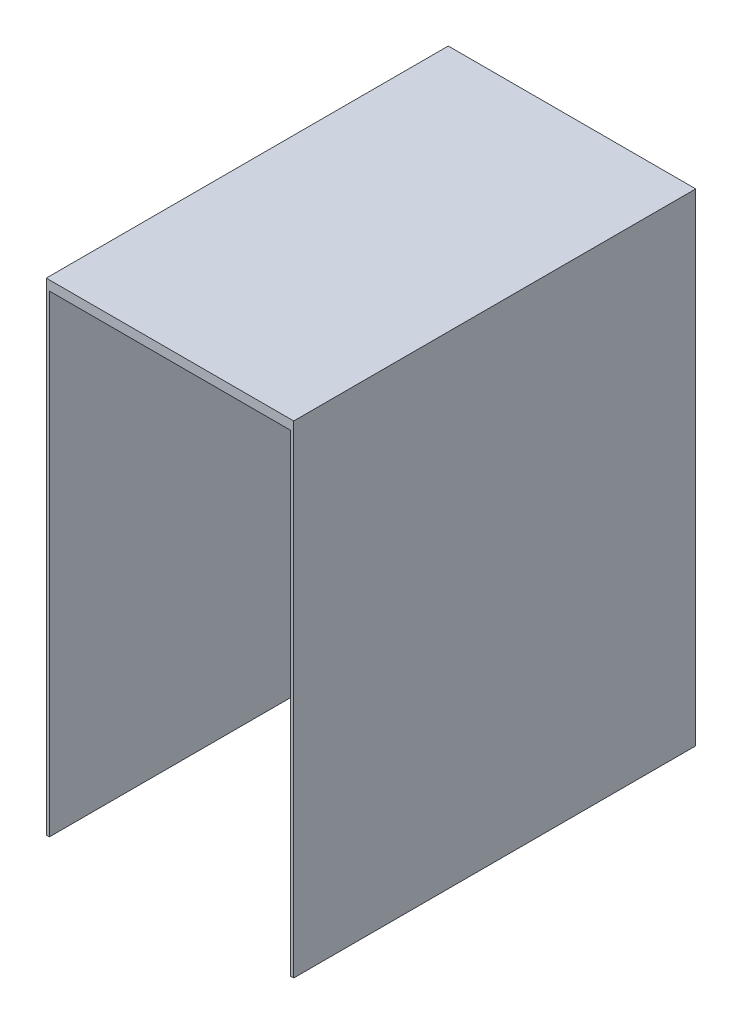
ISO-10303-21;
HEADER;
FILE_DESCRIPTION(('STEP AP214'),'2;1');
FILE_NAME('part.step','',(''),(''),'','','');
FILE_SCHEMA(('AUTOMOTIVE_DESIGN { 1 0 10303 214 1 1 1 1 }'));
ENDSEC;
DATA;
#1=APPLICATION_CONTEXT('core data for automotive mechanical design processes');
#2=APPLICATION_PROTOCOL_DEFINITION('international standard','automotive_design',2000,#1);
#3=PRODUCT_CONTEXT('',#1,'mechanical');
#4=PRODUCT('Part','Part','',(#3));
#5=PRODUCT_RELATED_PRODUCT_CATEGORY('part','',(#4));
#6=PRODUCT_DEFINITION_FORMATION('','',#4);
#7=PRODUCT_DEFINITION_CONTEXT('part definition',#1,'design');
#8=PRODUCT_DEFINITION('design','',#6,#7);
#9=PRODUCT_DEFINITION_SHAPE('','',#8);
#10=(LENGTH_UNIT() NAMED_UNIT(*) SI_UNIT(.MILLI.,.METRE.));
#11=(NAMED_UNIT(*) PLANE_ANGLE_UNIT() SI_UNIT($,.RADIAN.));
#12=(NAMED_UNIT(*) SI_UNIT($,.STERADIAN.) SOLID_ANGLE_UNIT());
#13=UNCERTAINTY_MEASURE_WITH_UNIT(LENGTH_MEASURE(1.E-05),#10,'distance_accuracy_value','');
#14=(GEOMETRIC_REPRESENTATION_CONTEXT(3) GLOBAL_UNCERTAINTY_ASSIGNED_CONTEXT((#13)) GLOBAL_UNIT_ASSIGNED_CONTEXT((#10,
#11,#12)) REPRESENTATION_CONTEXT('',''));
#15=CARTESIAN_POINT('',(0.,0.,0.));
#16=DIRECTION('',(0.,0.,1.));
#17=DIRECTION('',(1.,0.,0.));
#18=AXIS2_PLACEMENT_3D('',#15,#16,#17);
#19=CARTESIAN_POINT('',(0.990599999999999,0.,127.));
#20=DIRECTION('',(0.,1.,0.));
#21=DIRECTION('',(-1.,0.,0.));
#22=AXIS2_PLACEMENT_3D('',#19,#20,#21);
#23=PLANE('',#22);
#24=DIRECTION('',(1.,0.,0.));
#25=VECTOR('',#24,1.);
#26=CARTESIAN_POINT('',(0.990599999999999,0.,0.));
#27=LINE('',#26,#25);
#28=CARTESIAN_POINT('',(0.,0.,0.));
#29=VERTEX_POINT('',#28);
#30=CARTESIAN_POINT('',(0.990599999999999,0.,0.));
#31=VERTEX_POINT('',#30);
#32=EDGE_CURVE('E129',#29,#31,#27,.T.);
#33=ORIENTED_EDGE('',*,*,#32,.T.);
#34=DIRECTION('',(0.,0.,-1.));
#35=VECTOR('',#34,1.);
#36=CARTESIAN_POINT('',(0.990599999999999,0.,127.));
#37=LINE('',#36,#35);
#38=CARTESIAN_POINT('',(0.990599999999999,0.,127.));
#39=VERTEX_POINT('',#38);
#40=EDGE_CURVE('E11',#39,#31,#37,.T.);
#41=ORIENTED_EDGE('',*,*,#40,.F.);
#42=DIRECTION('',(1.,0.,0.));
#43=VECTOR('',#42,1.);
#44=CARTESIAN_POINT('',(0.990599999999999,0.,127.));
#45=LINE('',#44,#43);
#46=CARTESIAN_POINT('',(0.,0.,127.));
#47=VERTEX_POINT('',#46);
#48=EDGE_CURVE('E143',#47,#39,#45,.T.);
#49=ORIENTED_EDGE('',*,*,#48,.F.);
#50=DIRECTION('',(0.,0.,-1.));
#51=VECTOR('',#50,1.);
#52=CARTESIAN_POINT('',(0.,0.,127.));
#53=LINE('',#52,#51);
#54=EDGE_CURVE('E125',#47,#29,#53,.T.);
#55=ORIENTED_EDGE('',*,*,#54,.T.);
#56=EDGE_LOOP('',(#33,#41,#49,#55));
#57=FACE_BOUND('',#56,.T.);
#58=ADVANCED_FACE('F33',(#57),#23,.F.);
#59=CARTESIAN_POINT('',(0.990599999999981,149.352,127.));
#60=DIRECTION('',(-1.,0.,0.));
#61=DIRECTION('',(0.,-1.,0.));
#62=AXIS2_PLACEMENT_3D('',#59,#60,#61);
#63=PLANE('',#62);
#64=DIRECTION('',(0.,1.,0.));
#65=VECTOR('',#64,1.);
#66=CARTESIAN_POINT('',(0.990599999999981,149.352,0.));
#67=LINE('',#66,#65);
#68=CARTESIAN_POINT('',(0.990599999999981,149.352,0.));
#69=VERTEX_POINT('',#68);
#70=EDGE_CURVE('E132',#31,#69,#67,.T.);
#71=ORIENTED_EDGE('',*,*,#70,.T.);
#72=DIRECTION('',(0.,0.,-1.));
#73=VECTOR('',#72,1.);
#74=CARTESIAN_POINT('',(0.990599999999981,149.352,127.));
#75=LINE('',#74,#73);
#76=CARTESIAN_POINT('',(0.990599999999981,149.352,127.));
#77=VERTEX_POINT('',#76);
#78=EDGE_CURVE('E41',#77,#69,#75,.T.);
#79=ORIENTED_EDGE('',*,*,#78,.F.);
#80=DIRECTION('',(0.,1.,0.));
#81=VECTOR('',#80,1.);
#82=CARTESIAN_POINT('',(0.990599999999981,149.352,127.));
#83=LINE('',#82,#81);
#84=EDGE_CURVE('E92',#39,#77,#83,.T.);
#85=ORIENTED_EDGE('',*,*,#84,.F.);
#86=ORIENTED_EDGE('',*,*,#40,.T.);
#87=EDGE_LOOP('',(#71,#79,#85,#86));
#88=FACE_BOUND('',#87,.T.);
#89=ADVANCED_FACE('F178',(#88),#63,.F.);
#90=CARTESIAN_POINT('',(77.1906,149.352,127.));
#91=DIRECTION('',(0.,1.,0.));
#92=DIRECTION('',(0.,0.,1.));
#93=AXIS2_PLACEMENT_3D('',#90,#91,#92);
#94=PLANE('',#93);
#95=DIRECTION('',(1.,0.,0.));
#96=VECTOR('',#95,1.);
#97=CARTESIAN_POINT('',(77.1906,149.352,0.));
#98=LINE('',#97,#96);
#99=CARTESIAN_POINT('',(77.1906,149.352,0.));
#100=VERTEX_POINT('',#99);
#101=EDGE_CURVE('E134',#69,#100,#98,.T.);
#102=ORIENTED_EDGE('',*,*,#101,.T.);
#103=DIRECTION('',(0.,0.,-1.));
#104=VECTOR('',#103,1.);
#105=CARTESIAN_POINT('',(77.1906,149.352,127.));
#106=LINE('',#105,#104);
#107=CARTESIAN_POINT('',(77.1906,149.352,127.));
#108=VERTEX_POINT('',#107);
#109=EDGE_CURVE('E150',#108,#100,#106,.T.);
#110=ORIENTED_EDGE('',*,*,#109,.F.);
#111=DIRECTION('',(1.,0.,0.));
#112=VECTOR('',#111,1.);
#113=CARTESIAN_POINT('',(77.1906,149.352,127.));
#114=LINE('',#113,#112);
#115=EDGE_CURVE('E158',#77,#108,#114,.T.);
#116=ORIENTED_EDGE('',*,*,#115,.F.);
#117=ORIENTED_EDGE('',*,*,#78,.T.);
#118=EDGE_LOOP('',(#102,#110,#116,#117));
#119=FACE_BOUND('',#118,.T.);
#120=ADVANCED_FACE('F156',(#119),#94,.F.);
#121=CARTESIAN_POINT('',(77.1906,0.,127.));
#122=DIRECTION('',(1.,0.,0.));
#123=DIRECTION('',(0.,0.,-1.));
#124=AXIS2_PLACEMENT_3D('',#121,#122,#123);
#125=PLANE('',#124);
#126=DIRECTION('',(0.,-1.,0.));
#127=VECTOR('',#126,1.);
#128=CARTESIAN_POINT('',(77.1906,0.,0.));
#129=LINE('',#128,#127);
#130=CARTESIAN_POINT('',(77.1906,0.,0.));
#131=VERTEX_POINT('',#130);
#132=EDGE_CURVE('E136',#100,#131,#129,.T.);
#133=ORIENTED_EDGE('',*,*,#132,.T.);
#134=DIRECTION('',(0.,0.,-1.));
#135=VECTOR('',#134,1.);
#136=CARTESIAN_POINT('',(77.1906,0.,127.));
#137=LINE('',#136,#135);
#138=CARTESIAN_POINT('',(77.1906,0.,127.));
#139=VERTEX_POINT('',#138);
#140=EDGE_CURVE('E147',#139,#131,#137,.T.);
#141=ORIENTED_EDGE('',*,*,#140,.F.);
#142=DIRECTION('',(0.,-1.,0.));
#143=VECTOR('',#142,1.);
#144=CARTESIAN_POINT('',(77.1906,0.,127.));
#145=LINE('',#144,#143);
#146=EDGE_CURVE('E170',#108,#139,#145,.T.);
#147=ORIENTED_EDGE('',*,*,#146,.F.);
#148=ORIENTED_EDGE('',*,*,#109,.T.);
#149=EDGE_LOOP('',(#133,#141,#147,#148));
#150=FACE_BOUND('',#149,.T.);
#151=ADVANCED_FACE('F166',(#150),#125,.F.);
#152=CARTESIAN_POINT('',(78.1812,0.,127.));
#153=DIRECTION('',(0.,1.,0.));
#154=DIRECTION('',(-1.,0.,0.));
#155=AXIS2_PLACEMENT_3D('',#152,#153,#154);
#156=PLANE('',#155);
#157=DIRECTION('',(1.,0.,0.));
#158=VECTOR('',#157,1.);
#159=CARTESIAN_POINT('',(78.1812,0.,0.));
#160=LINE('',#159,#158);
#161=CARTESIAN_POINT('',(78.1812,0.,0.));
#162=VERTEX_POINT('',#161);
#163=EDGE_CURVE('E138',#131,#162,#160,.T.);
#164=ORIENTED_EDGE('',*,*,#163,.T.);
#165=DIRECTION('',(0.,0.,-1.));
#166=VECTOR('',#165,1.);
#167=CARTESIAN_POINT('',(78.1812,0.,127.));
#168=LINE('',#167,#166);
#169=CARTESIAN_POINT('',(78.1812,0.,127.));
#170=VERTEX_POINT('',#169);
#171=EDGE_CURVE('E120',#170,#162,#168,.T.);
#172=ORIENTED_EDGE('',*,*,#171,.F.);
#173=DIRECTION('',(1.,0.,0.));
#174=VECTOR('',#173,1.);
#175=CARTESIAN_POINT('',(78.1812,0.,127.));
#176=LINE('',#175,#174);
#177=EDGE_CURVE('E111',#139,#170,#176,.T.);
#178=ORIENTED_EDGE('',*,*,#177,.F.);
#179=ORIENTED_EDGE('',*,*,#140,.T.);
#180=EDGE_LOOP('',(#164,#172,#178,#179));
#181=FACE_BOUND('',#180,.T.);
#182=ADVANCED_FACE('F169',(#181),#156,.F.);
#183=CARTESIAN_POINT('',(78.1812,152.4,127.));
#184=DIRECTION('',(-1.,0.,0.));
#185=DIRECTION('',(0.,-1.,0.));
#186=AXIS2_PLACEMENT_3D('',#183,#184,#185);
#187=PLANE('',#186);
#188=DIRECTION('',(0.,1.,0.));
#189=VECTOR('',#188,1.);
#190=CARTESIAN_POINT('',(78.1812,152.4,0.));
#191=LINE('',#190,#189);
#192=CARTESIAN_POINT('',(78.1812,152.4,0.));
#193=VERTEX_POINT('',#192);
#194=EDGE_CURVE('E119',#162,#193,#191,.T.);
#195=ORIENTED_EDGE('',*,*,#194,.T.);
#196=DIRECTION('',(0.,0.,-1.));
#197=VECTOR('',#196,1.);
#198=CARTESIAN_POINT('',(78.1812,152.4,127.));
#199=LINE('',#198,#197);
#200=CARTESIAN_POINT('',(78.1812,152.4,127.));
#201=VERTEX_POINT('',#200);
#202=EDGE_CURVE('E116',#201,#193,#199,.T.);
#203=ORIENTED_EDGE('',*,*,#202,.F.);
#204=DIRECTION('',(0.,1.,0.));
#205=VECTOR('',#204,1.);
#206=CARTESIAN_POINT('',(78.1812,152.4,127.));
#207=LINE('',#206,#205);
#208=EDGE_CURVE('E105',#170,#201,#207,.T.);
#209=ORIENTED_EDGE('',*,*,#208,.F.);
#210=ORIENTED_EDGE('',*,*,#171,.T.);
#211=EDGE_LOOP('',(#195,#203,#209,#210));
#212=FACE_BOUND('',#211,.T.);
#213=ADVANCED_FACE('F117',(#212),#187,.F.);
#214=CARTESIAN_POINT('',(0.,152.4,127.));
#215=DIRECTION('',(0.,-1.,0.));
#216=DIRECTION('',(0.,0.,-1.));
#217=AXIS2_PLACEMENT_3D('',#214,#215,#216);
#218=PLANE('',#217);
#219=DIRECTION('',(-1.,0.,0.));
#220=VECTOR('',#219,1.);
#221=CARTESIAN_POINT('',(0.,152.4,0.));
#222=LINE('',#221,#220);
#223=CARTESIAN_POINT('',(0.,152.4,0.));
#224=VERTEX_POINT('',#223);
#225=EDGE_CURVE('E78',#193,#224,#222,.T.);
#226=ORIENTED_EDGE('',*,*,#225,.T.);
#227=DIRECTION('',(0.,0.,-1.));
#228=VECTOR('',#227,1.);
#229=CARTESIAN_POINT('',(0.,152.4,127.));
#230=LINE('',#229,#228);
#231=CARTESIAN_POINT('',(0.,152.4,127.));
#232=VERTEX_POINT('',#231);
#233=EDGE_CURVE('E121',#232,#224,#230,.T.);
#234=ORIENTED_EDGE('',*,*,#233,.F.);
#235=DIRECTION('',(-1.,0.,0.));
#236=VECTOR('',#235,1.);
#237=CARTESIAN_POINT('',(0.,152.4,127.));
#238=LINE('',#237,#236);
#239=EDGE_CURVE('E109',#201,#232,#238,.T.);
#240=ORIENTED_EDGE('',*,*,#239,.F.);
#241=ORIENTED_EDGE('',*,*,#202,.T.);
#242=EDGE_LOOP('',(#226,#234,#240,#241));
#243=FACE_BOUND('',#242,.T.);
#244=ADVANCED_FACE('F123',(#243),#218,.F.);
#245=CARTESIAN_POINT('',(0.,0.,127.));
#246=DIRECTION('',(1.,0.,0.));
#247=DIRECTION('',(0.,0.,-1.));
#248=AXIS2_PLACEMENT_3D('',#245,#246,#247);
#249=PLANE('',#248);
#250=DIRECTION('',(0.,-1.,0.));
#251=VECTOR('',#250,1.);
#252=CARTESIAN_POINT('',(0.,0.,0.));
#253=LINE('',#252,#251);
#254=EDGE_CURVE('E84',#224,#29,#253,.T.);
#255=ORIENTED_EDGE('',*,*,#254,.T.);
#256=ORIENTED_EDGE('',*,*,#54,.F.);
#257=DIRECTION('',(0.,-1.,0.));
#258=VECTOR('',#257,1.);
#259=CARTESIAN_POINT('',(0.,0.,127.));
#260=LINE('',#259,#258);
#261=EDGE_CURVE('E49',#232,#47,#260,.T.);
#262=ORIENTED_EDGE('',*,*,#261,.F.);
#263=ORIENTED_EDGE('',*,*,#233,.T.);
#264=EDGE_LOOP('',(#255,#256,#262,#263));
#265=FACE_BOUND('',#264,.T.);
#266=ADVANCED_FACE('F194',(#265),#249,.F.);
#267=CARTESIAN_POINT('',(0.,0.,127.));
#268=DIRECTION('',(0.,0.,-1.));
#269=DIRECTION('',(-1.,0.,0.));
#270=AXIS2_PLACEMENT_3D('',#267,#268,#269);
#271=PLANE('',#270);
#272=ORIENTED_EDGE('',*,*,#48,.T.);
#273=ORIENTED_EDGE('',*,*,#84,.T.);
#274=ORIENTED_EDGE('',*,*,#115,.T.);
#275=ORIENTED_EDGE('',*,*,#146,.T.);
#276=ORIENTED_EDGE('',*,*,#177,.T.);
#277=ORIENTED_EDGE('',*,*,#208,.T.);
#278=ORIENTED_EDGE('',*,*,#239,.T.);
#279=ORIENTED_EDGE('',*,*,#261,.T.);
#280=EDGE_LOOP('',(#272,#273,#274,#275,#276,#277,#278,#279));
#281=FACE_BOUND('',#280,.T.);
#282=ADVANCED_FACE('F107',(#281),#271,.F.);
#283=CARTESIAN_POINT('',(0.,0.,0.));
#284=DIRECTION('',(0.,0.,-1.));
#285=DIRECTION('',(-1.,0.,0.));
#286=AXIS2_PLACEMENT_3D('',#283,#284,#285);
#287=PLANE('',#286);
#288=ORIENTED_EDGE('',*,*,#32,.F.);
#289=ORIENTED_EDGE('',*,*,#254,.F.);
#290=ORIENTED_EDGE('',*,*,#225,.F.);
#291=ORIENTED_EDGE('',*,*,#194,.F.);
#292=ORIENTED_EDGE('',*,*,#163,.F.);
#293=ORIENTED_EDGE('',*,*,#132,.F.);
#294=ORIENTED_EDGE('',*,*,#101,.F.);
#295=ORIENTED_EDGE('',*,*,#70,.F.);
#296=EDGE_LOOP('',(#288,#289,#290,#291,#292,#293,#294,#295));
#297=FACE_BOUND('',#296,.T.);
#298=ADVANCED_FACE('F162',(#297),#287,.T.);
#299=CLOSED_SHELL('',(#58,#89,#120,#151,#182,#213,#244,#266,#282,#298));
#300=MANIFOLD_SOLID_BREP('B2',#299);
#301=ADVANCED_BREP_SHAPE_REPRESENTATION('',(#18,#300),#14);
#302=SHAPE_DEFINITION_REPRESENTATION(#9,#301);
ENDSEC;
END-ISO-10303-21;
